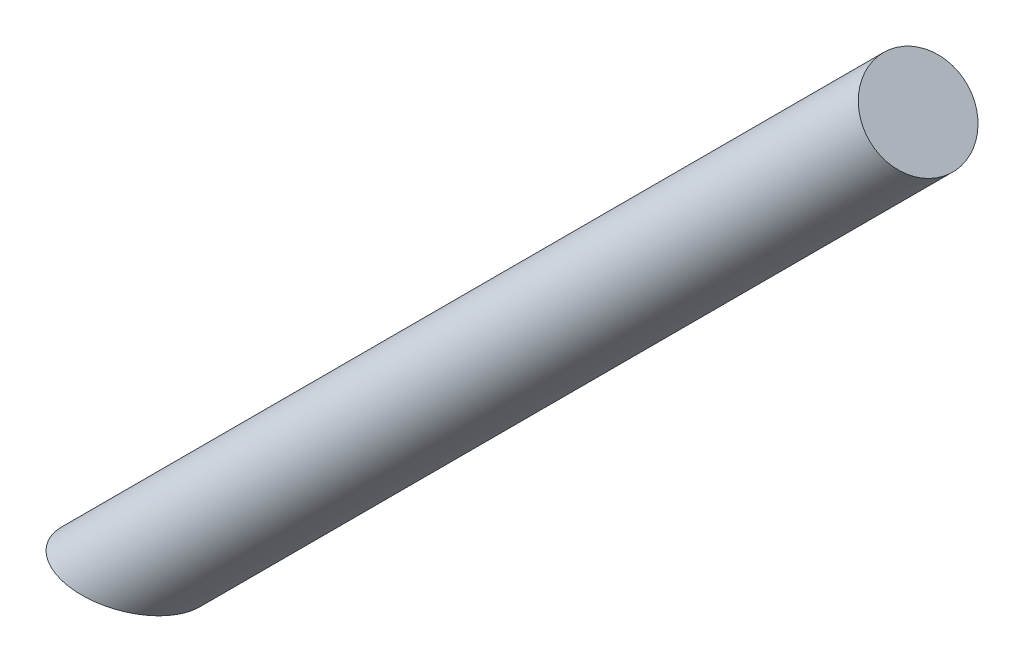
ISO-10303-21;
HEADER;
FILE_DESCRIPTION(('STEP AP214'),'2;1');
FILE_NAME('part.step','',(''),(''),'','','');
FILE_SCHEMA(('AUTOMOTIVE_DESIGN { 1 0 10303 214 1 1 1 1 }'));
ENDSEC;
DATA;
#1=APPLICATION_CONTEXT('core data for automotive mechanical design processes');
#2=APPLICATION_PROTOCOL_DEFINITION('international standard','automotive_design',2000,#1);
#3=PRODUCT_CONTEXT('',#1,'mechanical');
#4=PRODUCT('Part','Part','',(#3));
#5=PRODUCT_RELATED_PRODUCT_CATEGORY('part','',(#4));
#6=PRODUCT_DEFINITION_FORMATION('','',#4);
#7=PRODUCT_DEFINITION_CONTEXT('part definition',#1,'design');
#8=PRODUCT_DEFINITION('design','',#6,#7);
#9=PRODUCT_DEFINITION_SHAPE('','',#8);
#10=(LENGTH_UNIT() NAMED_UNIT(*) SI_UNIT(.MILLI.,.METRE.));
#11=(NAMED_UNIT(*) PLANE_ANGLE_UNIT() SI_UNIT($,.RADIAN.));
#12=(NAMED_UNIT(*) SI_UNIT($,.STERADIAN.) SOLID_ANGLE_UNIT());
#13=UNCERTAINTY_MEASURE_WITH_UNIT(LENGTH_MEASURE(1.E-05),#10,'distance_accuracy_value','');
#14=(GEOMETRIC_REPRESENTATION_CONTEXT(3) GLOBAL_UNCERTAINTY_ASSIGNED_CONTEXT((#13)) GLOBAL_UNIT_ASSIGNED_CONTEXT((#10,
#11,#12)) REPRESENTATION_CONTEXT('',''));
#15=CARTESIAN_POINT('',(0.,0.,0.));
#16=DIRECTION('',(0.,0.,1.));
#17=DIRECTION('',(1.,0.,0.));
#18=AXIS2_PLACEMENT_3D('',#15,#16,#17);
#19=CARTESIAN_POINT('',(0.,3.,-32.5));
#20=DIRECTION('',(0.,-1.,0.));
#21=DIRECTION('',(0.,0.,-1.));
#22=AXIS2_PLACEMENT_3D('',#19,#20,#21);
#23=PLANE('',#22);
#24=CARTESIAN_POINT('',(5.3725830020307,3.,37.5));
#25=DIRECTION('',(0.,-1.,0.));
#26=DIRECTION('',(1.,0.,0.));
#27=AXIS2_PLACEMENT_3D('',#24,#25,#26);
#28=ELLIPSE('',#27,4.24264068711928,3.);
#29=CARTESIAN_POINT('',(9.61522368914998,3.,37.5));
#30=VERTEX_POINT('',#29);
#31=EDGE_CURVE('E10',#30,#30,#28,.F.);
#32=ORIENTED_EDGE('',*,*,#31,.F.);
#33=EDGE_LOOP('',(#32));
#34=FACE_BOUND('',#33,.T.);
#35=ADVANCED_FACE('F30',(#34),#23,.T.);
#36=CARTESIAN_POINT('',(53.6862915010152,51.3137084989847,37.5));
#37=DIRECTION('',(0.707106781186546,0.707106781186549,0.));
#38=DIRECTION('',(-0.707106781186549,0.707106781186546,0.));
#39=AXIS2_PLACEMENT_3D('',#36,#37,#38);
#40=PLANE('',#39);
#41=CARTESIAN_POINT('',(53.6862915010152,51.3137084989847,37.5));
#42=DIRECTION('',(0.707106781186546,0.707106781186549,0.));
#43=DIRECTION('',(-0.707106781186549,0.707106781186546,0.));
#44=AXIS2_PLACEMENT_3D('',#41,#42,#43);
#45=CIRCLE('',#44,3.);
#46=CARTESIAN_POINT('',(51.5649711574556,53.4350288425444,37.5));
#47=VERTEX_POINT('',#46);
#48=EDGE_CURVE('E36',#47,#47,#45,.T.);
#49=ORIENTED_EDGE('',*,*,#48,.T.);
#50=EDGE_LOOP('',(#49));
#51=FACE_BOUND('',#50,.T.);
#52=ADVANCED_FACE('F42',(#51),#40,.T.);
#53=CARTESIAN_POINT('',(-1.87005768508856,-4.24264068711929,37.5));
#54=DIRECTION('',(0.707106781186546,0.707106781186549,0.));
#55=DIRECTION('',(-0.707106781186549,0.707106781186546,0.));
#56=AXIS2_PLACEMENT_3D('',#53,#54,#55);
#57=CYLINDRICAL_SURFACE('',#56,3.);
#58=ORIENTED_EDGE('',*,*,#48,.F.);
#59=EDGE_LOOP('',(#58));
#60=FACE_BOUND('',#59,.T.);
#61=ORIENTED_EDGE('',*,*,#31,.T.);
#62=EDGE_LOOP('',(#61));
#63=FACE_BOUND('',#62,.T.);
#64=ADVANCED_FACE('F44',(#60,#63),#57,.T.);
#65=CLOSED_SHELL('',(#35,#52,#64));
#66=MANIFOLD_SOLID_BREP('B2',#65);
#67=ADVANCED_BREP_SHAPE_REPRESENTATION('',(#18,#66),#14);
#68=SHAPE_DEFINITION_REPRESENTATION(#9,#67);
ENDSEC;
END-ISO-10303-21;
